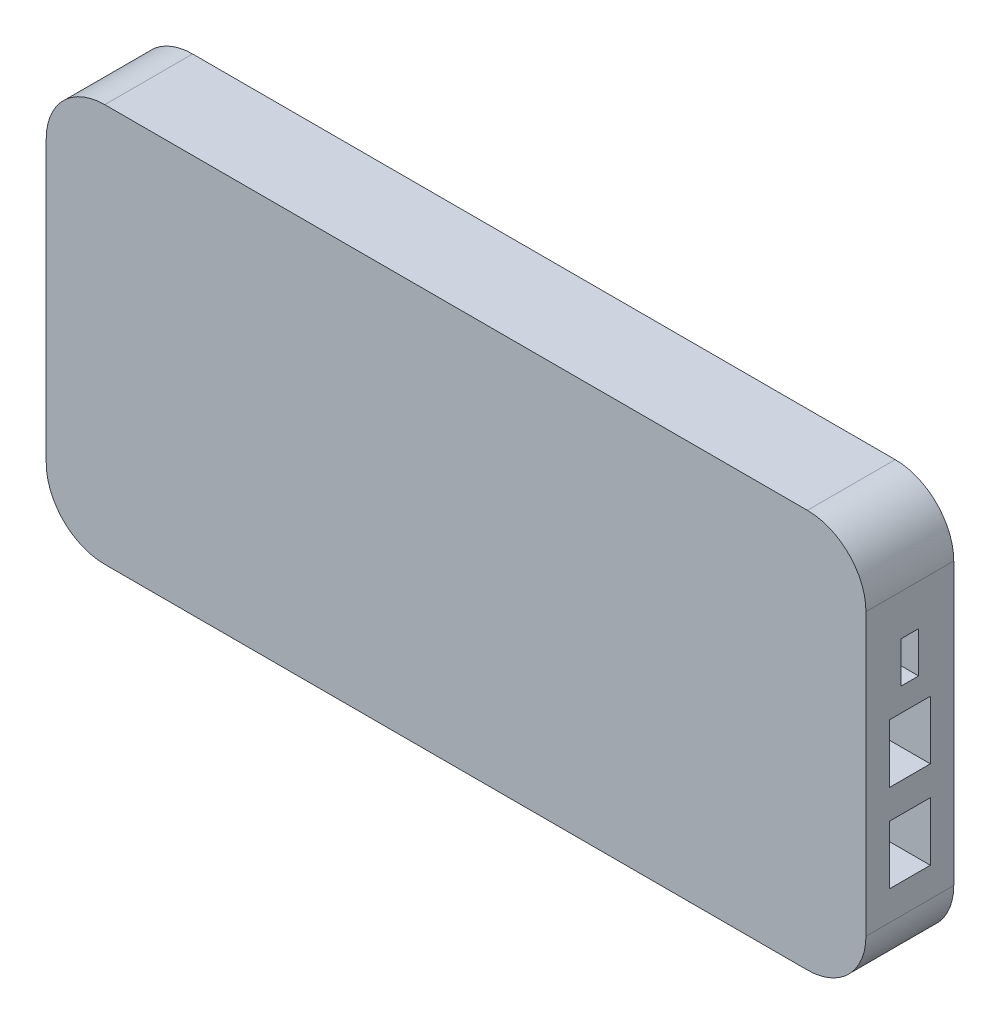
ISO-10303-21;
HEADER;
FILE_DESCRIPTION(('STEP AP214'),'2;1');
FILE_NAME('part.step','',(''),(''),'','','');
FILE_SCHEMA(('AUTOMOTIVE_DESIGN { 1 0 10303 214 1 1 1 1 }'));
ENDSEC;
DATA;
#1=APPLICATION_CONTEXT('core data for automotive mechanical design processes');
#2=APPLICATION_PROTOCOL_DEFINITION('international standard','automotive_design',2000,#1);
#3=PRODUCT_CONTEXT('',#1,'mechanical');
#4=PRODUCT('Part','Part','',(#3));
#5=PRODUCT_RELATED_PRODUCT_CATEGORY('part','',(#4));
#6=PRODUCT_DEFINITION_FORMATION('','',#4);
#7=PRODUCT_DEFINITION_CONTEXT('part definition',#1,'design');
#8=PRODUCT_DEFINITION('design','',#6,#7);
#9=PRODUCT_DEFINITION_SHAPE('','',#8);
#10=(LENGTH_UNIT() NAMED_UNIT(*) SI_UNIT(.MILLI.,.METRE.));
#11=(NAMED_UNIT(*) PLANE_ANGLE_UNIT() SI_UNIT($,.RADIAN.));
#12=(NAMED_UNIT(*) SI_UNIT($,.STERADIAN.) SOLID_ANGLE_UNIT());
#13=UNCERTAINTY_MEASURE_WITH_UNIT(LENGTH_MEASURE(1.E-05),#10,'distance_accuracy_value','');
#14=(GEOMETRIC_REPRESENTATION_CONTEXT(3) GLOBAL_UNCERTAINTY_ASSIGNED_CONTEXT((#13)) GLOBAL_UNIT_ASSIGNED_CONTEXT((#10,
#11,#12)) REPRESENTATION_CONTEXT('',''));
#15=CARTESIAN_POINT('',(0.,0.,0.));
#16=DIRECTION('',(0.,0.,1.));
#17=DIRECTION('',(1.,0.,0.));
#18=AXIS2_PLACEMENT_3D('',#15,#16,#17);
#19=CARTESIAN_POINT('',(130.,10.,15.));
#20=DIRECTION('',(0.,0.,-1.));
#21=DIRECTION('',(-1.,0.,0.));
#22=AXIS2_PLACEMENT_3D('',#19,#20,#21);
#23=CYLINDRICAL_SURFACE('',#22,10.);
#24=CARTESIAN_POINT('',(130.,10.,0.));
#25=DIRECTION('',(0.,0.,1.));
#26=DIRECTION('',(1.,0.,0.));
#27=AXIS2_PLACEMENT_3D('',#24,#25,#26);
#28=CIRCLE('',#27,10.);
#29=CARTESIAN_POINT('',(130.,0.,0.));
#30=VERTEX_POINT('',#29);
#31=CARTESIAN_POINT('',(140.,10.0000000000001,0.));
#32=VERTEX_POINT('',#31);
#33=EDGE_CURVE('E222',#30,#32,#28,.T.);
#34=ORIENTED_EDGE('',*,*,#33,.T.);
#35=DIRECTION('',(0.,0.,-1.));
#36=VECTOR('',#35,1.);
#37=CARTESIAN_POINT('',(140.,10.0000000000001,15.));
#38=LINE('',#37,#36);
#39=CARTESIAN_POINT('',(140.,10.0000000000001,15.));
#40=VERTEX_POINT('',#39);
#41=EDGE_CURVE('E11',#40,#32,#38,.T.);
#42=ORIENTED_EDGE('',*,*,#41,.F.);
#43=CARTESIAN_POINT('',(130.,10.,15.));
#44=DIRECTION('',(0.,0.,1.));
#45=DIRECTION('',(1.,0.,0.));
#46=AXIS2_PLACEMENT_3D('',#43,#44,#45);
#47=CIRCLE('',#46,10.);
#48=CARTESIAN_POINT('',(130.,0.,15.));
#49=VERTEX_POINT('',#48);
#50=EDGE_CURVE('E313',#49,#40,#47,.T.);
#51=ORIENTED_EDGE('',*,*,#50,.F.);
#52=DIRECTION('',(0.,0.,-1.));
#53=VECTOR('',#52,1.);
#54=CARTESIAN_POINT('',(130.,0.,15.));
#55=LINE('',#54,#53);
#56=EDGE_CURVE('E339',#49,#30,#55,.T.);
#57=ORIENTED_EDGE('',*,*,#56,.T.);
#58=EDGE_LOOP('',(#34,#42,#51,#57));
#59=FACE_BOUND('',#58,.T.);
#60=ADVANCED_FACE('F39',(#59),#23,.T.);
#61=CARTESIAN_POINT('',(140.,10.0000000000001,15.));
#62=DIRECTION('',(-1.,0.,0.));
#63=DIRECTION('',(0.,0.,1.));
#64=AXIS2_PLACEMENT_3D('',#61,#62,#63);
#65=PLANE('',#64);
#66=DIRECTION('',(0.,0.,-1.));
#67=VECTOR('',#66,1.);
#68=CARTESIAN_POINT('',(140.,15.0000000000001,11.));
#69=LINE('',#68,#67);
#70=CARTESIAN_POINT('',(140.,15.0000000000001,11.));
#71=VERTEX_POINT('',#70);
#72=CARTESIAN_POINT('',(140.,15.0000000000001,4.));
#73=VERTEX_POINT('',#72);
#74=EDGE_CURVE('E212',#71,#73,#69,.T.);
#75=ORIENTED_EDGE('',*,*,#74,.F.);
#76=DIRECTION('',(0.,-1.,0.));
#77=VECTOR('',#76,1.);
#78=CARTESIAN_POINT('',(140.,25.0000000000001,11.));
#79=LINE('',#78,#77);
#80=CARTESIAN_POINT('',(140.,25.0000000000001,11.));
#81=VERTEX_POINT('',#80);
#82=EDGE_CURVE('E54',#81,#71,#79,.T.);
#83=ORIENTED_EDGE('',*,*,#82,.F.);
#84=DIRECTION('',(0.,0.,1.));
#85=VECTOR('',#84,1.);
#86=CARTESIAN_POINT('',(140.,25.0000000000001,11.));
#87=LINE('',#86,#85);
#88=CARTESIAN_POINT('',(140.,25.0000000000001,4.));
#89=VERTEX_POINT('',#88);
#90=EDGE_CURVE('E199',#89,#81,#87,.T.);
#91=ORIENTED_EDGE('',*,*,#90,.F.);
#92=DIRECTION('',(0.,1.,0.));
#93=VECTOR('',#92,1.);
#94=CARTESIAN_POINT('',(140.,25.0000000000001,4.));
#95=LINE('',#94,#93);
#96=EDGE_CURVE('E203',#73,#89,#95,.T.);
#97=ORIENTED_EDGE('',*,*,#96,.F.);
#98=EDGE_LOOP('',(#75,#83,#91,#97));
#99=FACE_BOUND('',#98,.T.);
#100=DIRECTION('',(0.,0.,-1.));
#101=VECTOR('',#100,1.);
#102=CARTESIAN_POINT('',(140.,30.0000000000001,11.));
#103=LINE('',#102,#101);
#104=CARTESIAN_POINT('',(140.,30.0000000000001,11.));
#105=VERTEX_POINT('',#104);
#106=CARTESIAN_POINT('',(140.,30.0000000000001,4.));
#107=VERTEX_POINT('',#106);
#108=EDGE_CURVE('E248',#105,#107,#103,.T.);
#109=ORIENTED_EDGE('',*,*,#108,.F.);
#110=DIRECTION('',(0.,-1.,0.));
#111=VECTOR('',#110,1.);
#112=CARTESIAN_POINT('',(140.,40.0000000000001,11.));
#113=LINE('',#112,#111);
#114=CARTESIAN_POINT('',(140.,40.0000000000001,11.));
#115=VERTEX_POINT('',#114);
#116=EDGE_CURVE('E62',#115,#105,#113,.T.);
#117=ORIENTED_EDGE('',*,*,#116,.F.);
#118=DIRECTION('',(0.,0.,1.));
#119=VECTOR('',#118,1.);
#120=CARTESIAN_POINT('',(140.,40.0000000000001,11.));
#121=LINE('',#120,#119);
#122=CARTESIAN_POINT('',(140.,40.0000000000001,4.));
#123=VERTEX_POINT('',#122);
#124=EDGE_CURVE('E233',#123,#115,#121,.T.);
#125=ORIENTED_EDGE('',*,*,#124,.F.);
#126=DIRECTION('',(0.,1.,0.));
#127=VECTOR('',#126,1.);
#128=CARTESIAN_POINT('',(140.,40.0000000000001,4.));
#129=LINE('',#128,#127);
#130=EDGE_CURVE('E253',#107,#123,#129,.T.);
#131=ORIENTED_EDGE('',*,*,#130,.F.);
#132=EDGE_LOOP('',(#109,#117,#125,#131));
#133=FACE_BOUND('',#132,.T.);
#134=DIRECTION('',(0.,0.,-1.));
#135=VECTOR('',#134,1.);
#136=CARTESIAN_POINT('',(140.,44.0000000000001,9.));
#137=LINE('',#136,#135);
#138=CARTESIAN_POINT('',(140.,44.0000000000001,9.));
#139=VERTEX_POINT('',#138);
#140=CARTESIAN_POINT('',(140.,44.0000000000001,6.));
#141=VERTEX_POINT('',#140);
#142=EDGE_CURVE('E291',#139,#141,#137,.T.);
#143=ORIENTED_EDGE('',*,*,#142,.F.);
#144=DIRECTION('',(0.,-1.,0.));
#145=VECTOR('',#144,1.);
#146=CARTESIAN_POINT('',(140.,51.0000000000001,9.));
#147=LINE('',#146,#145);
#148=CARTESIAN_POINT('',(140.,51.0000000000001,9.));
#149=VERTEX_POINT('',#148);
#150=EDGE_CURVE('E288',#149,#139,#147,.T.);
#151=ORIENTED_EDGE('',*,*,#150,.F.);
#152=DIRECTION('',(0.,0.,1.));
#153=VECTOR('',#152,1.);
#154=CARTESIAN_POINT('',(140.,51.0000000000001,9.));
#155=LINE('',#154,#153);
#156=CARTESIAN_POINT('',(140.,51.0000000000001,6.));
#157=VERTEX_POINT('',#156);
#158=EDGE_CURVE('E275',#157,#149,#155,.T.);
#159=ORIENTED_EDGE('',*,*,#158,.F.);
#160=DIRECTION('',(0.,1.,0.));
#161=VECTOR('',#160,1.);
#162=CARTESIAN_POINT('',(140.,51.0000000000001,6.));
#163=LINE('',#162,#161);
#164=EDGE_CURVE('E295',#141,#157,#163,.T.);
#165=ORIENTED_EDGE('',*,*,#164,.F.);
#166=EDGE_LOOP('',(#143,#151,#159,#165));
#167=FACE_BOUND('',#166,.T.);
#168=DIRECTION('',(0.,1.,0.));
#169=VECTOR('',#168,1.);
#170=CARTESIAN_POINT('',(140.,10.0000000000001,0.));
#171=LINE('',#170,#169);
#172=CARTESIAN_POINT('',(140.,57.9999999999999,0.));
#173=VERTEX_POINT('',#172);
#174=EDGE_CURVE('E343',#32,#173,#171,.T.);
#175=ORIENTED_EDGE('',*,*,#174,.T.);
#176=DIRECTION('',(0.,0.,-1.));
#177=VECTOR('',#176,1.);
#178=CARTESIAN_POINT('',(140.,57.9999999999999,15.));
#179=LINE('',#178,#177);
#180=CARTESIAN_POINT('',(140.,57.9999999999999,15.));
#181=VERTEX_POINT('',#180);
#182=EDGE_CURVE('E47',#181,#173,#179,.T.);
#183=ORIENTED_EDGE('',*,*,#182,.F.);
#184=DIRECTION('',(0.,1.,0.));
#185=VECTOR('',#184,1.);
#186=CARTESIAN_POINT('',(140.,10.0000000000001,15.));
#187=LINE('',#186,#185);
#188=EDGE_CURVE('E317',#40,#181,#187,.T.);
#189=ORIENTED_EDGE('',*,*,#188,.F.);
#190=ORIENTED_EDGE('',*,*,#41,.T.);
#191=EDGE_LOOP('',(#175,#183,#189,#190));
#192=FACE_BOUND('',#191,.T.);
#193=ADVANCED_FACE('F414',(#99,#133,#167,#192),#65,.F.);
#194=CARTESIAN_POINT('',(130.,58.,15.));
#195=DIRECTION('',(0.,0.,-1.));
#196=DIRECTION('',(-1.,0.,0.));
#197=AXIS2_PLACEMENT_3D('',#194,#195,#196);
#198=CYLINDRICAL_SURFACE('',#197,10.);
#199=CARTESIAN_POINT('',(130.,58.,0.));
#200=DIRECTION('',(0.,0.,1.));
#201=DIRECTION('',(-1.,0.,0.));
#202=AXIS2_PLACEMENT_3D('',#199,#200,#201);
#203=CIRCLE('',#202,10.);
#204=CARTESIAN_POINT('',(130.,68.,0.));
#205=VERTEX_POINT('',#204);
#206=EDGE_CURVE('E346',#173,#205,#203,.T.);
#207=ORIENTED_EDGE('',*,*,#206,.T.);
#208=DIRECTION('',(0.,0.,-1.));
#209=VECTOR('',#208,1.);
#210=CARTESIAN_POINT('',(130.,68.,15.));
#211=LINE('',#210,#209);
#212=CARTESIAN_POINT('',(130.,68.,15.));
#213=VERTEX_POINT('',#212);
#214=EDGE_CURVE('E382',#213,#205,#211,.T.);
#215=ORIENTED_EDGE('',*,*,#214,.F.);
#216=CARTESIAN_POINT('',(130.,58.,15.));
#217=DIRECTION('',(0.,0.,1.));
#218=DIRECTION('',(-1.,0.,0.));
#219=AXIS2_PLACEMENT_3D('',#216,#217,#218);
#220=CIRCLE('',#219,10.);
#221=EDGE_CURVE('E321',#181,#213,#220,.T.);
#222=ORIENTED_EDGE('',*,*,#221,.F.);
#223=ORIENTED_EDGE('',*,*,#182,.T.);
#224=EDGE_LOOP('',(#207,#215,#222,#223));
#225=FACE_BOUND('',#224,.T.);
#226=ADVANCED_FACE('F391',(#225),#198,.T.);
#227=CARTESIAN_POINT('',(10.0000000000001,68.,15.));
#228=DIRECTION('',(0.,-1.,0.));
#229=DIRECTION('',(0.,0.,-1.));
#230=AXIS2_PLACEMENT_3D('',#227,#228,#229);
#231=PLANE('',#230);
#232=DIRECTION('',(-1.,0.,0.));
#233=VECTOR('',#232,1.);
#234=CARTESIAN_POINT('',(10.0000000000001,68.,0.));
#235=LINE('',#234,#233);
#236=CARTESIAN_POINT('',(10.0000000000001,68.,0.));
#237=VERTEX_POINT('',#236);
#238=EDGE_CURVE('E349',#205,#237,#235,.T.);
#239=ORIENTED_EDGE('',*,*,#238,.T.);
#240=DIRECTION('',(0.,0.,-1.));
#241=VECTOR('',#240,1.);
#242=CARTESIAN_POINT('',(10.0000000000001,68.,15.));
#243=LINE('',#242,#241);
#244=CARTESIAN_POINT('',(10.0000000000001,68.,15.));
#245=VERTEX_POINT('',#244);
#246=EDGE_CURVE('E378',#245,#237,#243,.T.);
#247=ORIENTED_EDGE('',*,*,#246,.F.);
#248=DIRECTION('',(-1.,0.,0.));
#249=VECTOR('',#248,1.);
#250=CARTESIAN_POINT('',(10.0000000000001,68.,15.));
#251=LINE('',#250,#249);
#252=EDGE_CURVE('E324',#213,#245,#251,.T.);
#253=ORIENTED_EDGE('',*,*,#252,.F.);
#254=ORIENTED_EDGE('',*,*,#214,.T.);
#255=EDGE_LOOP('',(#239,#247,#253,#254));
#256=FACE_BOUND('',#255,.T.);
#257=ADVANCED_FACE('F402',(#256),#231,.F.);
#258=CARTESIAN_POINT('',(10.,58.,15.));
#259=DIRECTION('',(0.,0.,-1.));
#260=DIRECTION('',(-1.,0.,0.));
#261=AXIS2_PLACEMENT_3D('',#258,#259,#260);
#262=CYLINDRICAL_SURFACE('',#261,10.);
#263=CARTESIAN_POINT('',(10.,58.,0.));
#264=DIRECTION('',(0.,0.,1.));
#265=DIRECTION('',(1.,0.,0.));
#266=AXIS2_PLACEMENT_3D('',#263,#264,#265);
#267=CIRCLE('',#266,10.);
#268=CARTESIAN_POINT('',(0.,57.9999999999999,0.));
#269=VERTEX_POINT('',#268);
#270=EDGE_CURVE('E352',#237,#269,#267,.T.);
#271=ORIENTED_EDGE('',*,*,#270,.T.);
#272=DIRECTION('',(0.,0.,-1.));
#273=VECTOR('',#272,1.);
#274=CARTESIAN_POINT('',(0.,57.9999999999999,15.));
#275=LINE('',#274,#273);
#276=CARTESIAN_POINT('',(0.,57.9999999999999,15.));
#277=VERTEX_POINT('',#276);
#278=EDGE_CURVE('E374',#277,#269,#275,.T.);
#279=ORIENTED_EDGE('',*,*,#278,.F.);
#280=CARTESIAN_POINT('',(10.,58.,15.));
#281=DIRECTION('',(0.,0.,1.));
#282=DIRECTION('',(1.,0.,0.));
#283=AXIS2_PLACEMENT_3D('',#280,#281,#282);
#284=CIRCLE('',#283,10.);
#285=EDGE_CURVE('E327',#245,#277,#284,.T.);
#286=ORIENTED_EDGE('',*,*,#285,.F.);
#287=ORIENTED_EDGE('',*,*,#246,.T.);
#288=EDGE_LOOP('',(#271,#279,#286,#287));
#289=FACE_BOUND('',#288,.T.);
#290=ADVANCED_FACE('F406',(#289),#262,.T.);
#291=CARTESIAN_POINT('',(0.,10.0000000000001,15.));
#292=DIRECTION('',(1.,0.,0.));
#293=DIRECTION('',(0.,0.,-1.));
#294=AXIS2_PLACEMENT_3D('',#291,#292,#293);
#295=PLANE('',#294);
#296=DIRECTION('',(0.,-1.,0.));
#297=VECTOR('',#296,1.);
#298=CARTESIAN_POINT('',(0.,10.0000000000001,0.));
#299=LINE('',#298,#297);
#300=CARTESIAN_POINT('',(0.,10.,0.));
#301=VERTEX_POINT('',#300);
#302=EDGE_CURVE('E355',#269,#301,#299,.T.);
#303=ORIENTED_EDGE('',*,*,#302,.T.);
#304=DIRECTION('',(0.,0.,-1.));
#305=VECTOR('',#304,1.);
#306=CARTESIAN_POINT('',(0.,10.,15.));
#307=LINE('',#306,#305);
#308=CARTESIAN_POINT('',(0.,10.,15.));
#309=VERTEX_POINT('',#308);
#310=EDGE_CURVE('E370',#309,#301,#307,.T.);
#311=ORIENTED_EDGE('',*,*,#310,.F.);
#312=DIRECTION('',(0.,-1.,0.));
#313=VECTOR('',#312,1.);
#314=CARTESIAN_POINT('',(0.,10.0000000000001,15.));
#315=LINE('',#314,#313);
#316=EDGE_CURVE('E330',#277,#309,#315,.T.);
#317=ORIENTED_EDGE('',*,*,#316,.F.);
#318=ORIENTED_EDGE('',*,*,#278,.T.);
#319=EDGE_LOOP('',(#303,#311,#317,#318));
#320=FACE_BOUND('',#319,.T.);
#321=ADVANCED_FACE('F427',(#320),#295,.F.);
#322=CARTESIAN_POINT('',(10.,10.,15.));
#323=DIRECTION('',(0.,0.,-1.));
#324=DIRECTION('',(-1.,0.,0.));
#325=AXIS2_PLACEMENT_3D('',#322,#323,#324);
#326=CYLINDRICAL_SURFACE('',#325,10.);
#327=CARTESIAN_POINT('',(10.,10.,0.));
#328=DIRECTION('',(0.,0.,1.));
#329=DIRECTION('',(-1.,0.,0.));
#330=AXIS2_PLACEMENT_3D('',#327,#328,#329);
#331=CIRCLE('',#330,10.);
#332=CARTESIAN_POINT('',(10.0000000000001,0.,0.));
#333=VERTEX_POINT('',#332);
#334=EDGE_CURVE('E358',#301,#333,#331,.T.);
#335=ORIENTED_EDGE('',*,*,#334,.T.);
#336=DIRECTION('',(0.,0.,-1.));
#337=VECTOR('',#336,1.);
#338=CARTESIAN_POINT('',(10.0000000000001,0.,15.));
#339=LINE('',#338,#337);
#340=CARTESIAN_POINT('',(10.0000000000001,0.,15.));
#341=VERTEX_POINT('',#340);
#342=EDGE_CURVE('E366',#341,#333,#339,.T.);
#343=ORIENTED_EDGE('',*,*,#342,.F.);
#344=CARTESIAN_POINT('',(10.,10.,15.));
#345=DIRECTION('',(0.,0.,1.));
#346=DIRECTION('',(-1.,0.,0.));
#347=AXIS2_PLACEMENT_3D('',#344,#345,#346);
#348=CIRCLE('',#347,10.);
#349=EDGE_CURVE('E333',#309,#341,#348,.T.);
#350=ORIENTED_EDGE('',*,*,#349,.F.);
#351=ORIENTED_EDGE('',*,*,#310,.T.);
#352=EDGE_LOOP('',(#335,#343,#350,#351));
#353=FACE_BOUND('',#352,.T.);
#354=ADVANCED_FACE('F425',(#353),#326,.T.);
#355=CARTESIAN_POINT('',(10.0000000000001,0.,15.));
#356=DIRECTION('',(0.,1.,0.));
#357=DIRECTION('',(0.,0.,1.));
#358=AXIS2_PLACEMENT_3D('',#355,#356,#357);
#359=PLANE('',#358);
#360=DIRECTION('',(1.,0.,0.));
#361=VECTOR('',#360,1.);
#362=CARTESIAN_POINT('',(10.0000000000001,0.,0.));
#363=LINE('',#362,#361);
#364=EDGE_CURVE('E318',#333,#30,#363,.T.);
#365=ORIENTED_EDGE('',*,*,#364,.T.);
#366=ORIENTED_EDGE('',*,*,#56,.F.);
#367=DIRECTION('',(1.,0.,0.));
#368=VECTOR('',#367,1.);
#369=CARTESIAN_POINT('',(10.0000000000001,0.,15.));
#370=LINE('',#369,#368);
#371=EDGE_CURVE('E336',#341,#49,#370,.T.);
#372=ORIENTED_EDGE('',*,*,#371,.F.);
#373=ORIENTED_EDGE('',*,*,#342,.T.);
#374=EDGE_LOOP('',(#365,#366,#372,#373));
#375=FACE_BOUND('',#374,.T.);
#376=ADVANCED_FACE('F420',(#375),#359,.F.);
#377=CARTESIAN_POINT('',(130.,10.,15.));
#378=DIRECTION('',(0.,0.,1.));
#379=DIRECTION('',(1.,0.,0.));
#380=AXIS2_PLACEMENT_3D('',#377,#378,#379);
#381=PLANE('',#380);
#382=ORIENTED_EDGE('',*,*,#50,.T.);
#383=ORIENTED_EDGE('',*,*,#188,.T.);
#384=ORIENTED_EDGE('',*,*,#221,.T.);
#385=ORIENTED_EDGE('',*,*,#252,.T.);
#386=ORIENTED_EDGE('',*,*,#285,.T.);
#387=ORIENTED_EDGE('',*,*,#316,.T.);
#388=ORIENTED_EDGE('',*,*,#349,.T.);
#389=ORIENTED_EDGE('',*,*,#371,.T.);
#390=EDGE_LOOP('',(#382,#383,#384,#385,#386,#387,#388,#389));
#391=FACE_BOUND('',#390,.T.);
#392=ADVANCED_FACE('F410',(#391),#381,.T.);
#393=CARTESIAN_POINT('',(130.,10.,0.));
#394=DIRECTION('',(0.,0.,1.));
#395=DIRECTION('',(1.,0.,0.));
#396=AXIS2_PLACEMENT_3D('',#393,#394,#395);
#397=PLANE('',#396);
#398=ORIENTED_EDGE('',*,*,#33,.F.);
#399=ORIENTED_EDGE('',*,*,#364,.F.);
#400=ORIENTED_EDGE('',*,*,#334,.F.);
#401=ORIENTED_EDGE('',*,*,#302,.F.);
#402=ORIENTED_EDGE('',*,*,#270,.F.);
#403=ORIENTED_EDGE('',*,*,#238,.F.);
#404=ORIENTED_EDGE('',*,*,#206,.F.);
#405=ORIENTED_EDGE('',*,*,#174,.F.);
#406=EDGE_LOOP('',(#398,#399,#400,#401,#402,#403,#404,#405));
#407=FACE_BOUND('',#406,.T.);
#408=ADVANCED_FACE('F397',(#407),#397,.F.);
#409=CARTESIAN_POINT('',(130.,51.0000000000001,9.));
#410=DIRECTION('',(0.,0.,1.));
#411=DIRECTION('',(0.,-1.,0.));
#412=AXIS2_PLACEMENT_3D('',#409,#410,#411);
#413=PLANE('',#412);
#414=ORIENTED_EDGE('',*,*,#150,.T.);
#415=DIRECTION('',(1.,0.,0.));
#416=VECTOR('',#415,1.);
#417=CARTESIAN_POINT('',(130.,44.0000000000001,9.));
#418=LINE('',#417,#416);
#419=CARTESIAN_POINT('',(130.,44.0000000000001,9.));
#420=VERTEX_POINT('',#419);
#421=EDGE_CURVE('E287',#420,#139,#418,.T.);
#422=ORIENTED_EDGE('',*,*,#421,.F.);
#423=DIRECTION('',(0.,-1.,0.));
#424=VECTOR('',#423,1.);
#425=CARTESIAN_POINT('',(130.,51.0000000000001,9.));
#426=LINE('',#425,#424);
#427=CARTESIAN_POINT('',(130.,51.0000000000001,9.));
#428=VERTEX_POINT('',#427);
#429=EDGE_CURVE('E270',#428,#420,#426,.T.);
#430=ORIENTED_EDGE('',*,*,#429,.F.);
#431=DIRECTION('',(1.,0.,0.));
#432=VECTOR('',#431,1.);
#433=CARTESIAN_POINT('',(130.,51.0000000000001,9.));
#434=LINE('',#433,#432);
#435=EDGE_CURVE('E249',#428,#149,#434,.T.);
#436=ORIENTED_EDGE('',*,*,#435,.T.);
#437=EDGE_LOOP('',(#414,#422,#430,#436));
#438=FACE_BOUND('',#437,.T.);
#439=ADVANCED_FACE('F490',(#438),#413,.F.);
#440=CARTESIAN_POINT('',(130.,51.0000000000001,9.));
#441=DIRECTION('',(0.,1.,0.));
#442=DIRECTION('',(0.,0.,1.));
#443=AXIS2_PLACEMENT_3D('',#440,#441,#442);
#444=PLANE('',#443);
#445=ORIENTED_EDGE('',*,*,#158,.T.);
#446=ORIENTED_EDGE('',*,*,#435,.F.);
#447=DIRECTION('',(0.,0.,1.));
#448=VECTOR('',#447,1.);
#449=CARTESIAN_POINT('',(130.,51.0000000000001,9.));
#450=LINE('',#449,#448);
#451=CARTESIAN_POINT('',(130.,51.0000000000001,6.));
#452=VERTEX_POINT('',#451);
#453=EDGE_CURVE('E283',#452,#428,#450,.T.);
#454=ORIENTED_EDGE('',*,*,#453,.F.);
#455=DIRECTION('',(1.,0.,0.));
#456=VECTOR('',#455,1.);
#457=CARTESIAN_POINT('',(130.,51.0000000000001,6.));
#458=LINE('',#457,#456);
#459=EDGE_CURVE('E304',#452,#157,#458,.T.);
#460=ORIENTED_EDGE('',*,*,#459,.T.);
#461=EDGE_LOOP('',(#445,#446,#454,#460));
#462=FACE_BOUND('',#461,.T.);
#463=ADVANCED_FACE('F506',(#462),#444,.F.);
#464=CARTESIAN_POINT('',(130.,51.0000000000001,6.));
#465=DIRECTION('',(0.,0.,-1.));
#466=DIRECTION('',(0.,1.,0.));
#467=AXIS2_PLACEMENT_3D('',#464,#465,#466);
#468=PLANE('',#467);
#469=ORIENTED_EDGE('',*,*,#164,.T.);
#470=ORIENTED_EDGE('',*,*,#459,.F.);
#471=DIRECTION('',(0.,1.,0.));
#472=VECTOR('',#471,1.);
#473=CARTESIAN_POINT('',(130.,51.0000000000001,6.));
#474=LINE('',#473,#472);
#475=CARTESIAN_POINT('',(130.,44.0000000000001,6.));
#476=VERTEX_POINT('',#475);
#477=EDGE_CURVE('E279',#476,#452,#474,.T.);
#478=ORIENTED_EDGE('',*,*,#477,.F.);
#479=DIRECTION('',(1.,0.,0.));
#480=VECTOR('',#479,1.);
#481=CARTESIAN_POINT('',(130.,44.0000000000001,6.));
#482=LINE('',#481,#480);
#483=EDGE_CURVE('E307',#476,#141,#482,.T.);
#484=ORIENTED_EDGE('',*,*,#483,.T.);
#485=EDGE_LOOP('',(#469,#470,#478,#484));
#486=FACE_BOUND('',#485,.T.);
#487=ADVANCED_FACE('F516',(#486),#468,.F.);
#488=CARTESIAN_POINT('',(130.,44.0000000000001,9.));
#489=DIRECTION('',(0.,-1.,0.));
#490=DIRECTION('',(0.,0.,-1.));
#491=AXIS2_PLACEMENT_3D('',#488,#489,#490);
#492=PLANE('',#491);
#493=ORIENTED_EDGE('',*,*,#142,.T.);
#494=ORIENTED_EDGE('',*,*,#483,.F.);
#495=DIRECTION('',(0.,0.,-1.));
#496=VECTOR('',#495,1.);
#497=CARTESIAN_POINT('',(130.,44.0000000000001,9.));
#498=LINE('',#497,#496);
#499=EDGE_CURVE('E274',#420,#476,#498,.T.);
#500=ORIENTED_EDGE('',*,*,#499,.F.);
#501=ORIENTED_EDGE('',*,*,#421,.T.);
#502=EDGE_LOOP('',(#493,#494,#500,#501));
#503=FACE_BOUND('',#502,.T.);
#504=ADVANCED_FACE('F526',(#503),#492,.F.);
#505=CARTESIAN_POINT('',(130.,0.,0.));
#506=DIRECTION('',(1.,0.,0.));
#507=DIRECTION('',(0.,0.,-1.));
#508=AXIS2_PLACEMENT_3D('',#505,#506,#507);
#509=PLANE('',#508);
#510=ORIENTED_EDGE('',*,*,#429,.T.);
#511=ORIENTED_EDGE('',*,*,#499,.T.);
#512=ORIENTED_EDGE('',*,*,#477,.T.);
#513=ORIENTED_EDGE('',*,*,#453,.T.);
#514=EDGE_LOOP('',(#510,#511,#512,#513));
#515=FACE_BOUND('',#514,.T.);
#516=ADVANCED_FACE('F536',(#515),#509,.T.);
#517=CARTESIAN_POINT('',(130.,40.0000000000001,11.));
#518=DIRECTION('',(0.,0.,1.));
#519=DIRECTION('',(0.,-1.,0.));
#520=AXIS2_PLACEMENT_3D('',#517,#518,#519);
#521=PLANE('',#520);
#522=ORIENTED_EDGE('',*,*,#116,.T.);
#523=DIRECTION('',(1.,0.,0.));
#524=VECTOR('',#523,1.);
#525=CARTESIAN_POINT('',(130.,30.0000000000001,11.));
#526=LINE('',#525,#524);
#527=CARTESIAN_POINT('',(130.,30.0000000000001,11.));
#528=VERTEX_POINT('',#527);
#529=EDGE_CURVE('E245',#528,#105,#526,.T.);
#530=ORIENTED_EDGE('',*,*,#529,.F.);
#531=DIRECTION('',(0.,-1.,0.));
#532=VECTOR('',#531,1.);
#533=CARTESIAN_POINT('',(130.,40.0000000000001,11.));
#534=LINE('',#533,#532);
#535=CARTESIAN_POINT('',(130.,40.0000000000001,11.));
#536=VERTEX_POINT('',#535);
#537=EDGE_CURVE('E228',#536,#528,#534,.T.);
#538=ORIENTED_EDGE('',*,*,#537,.F.);
#539=DIRECTION('',(1.,0.,0.));
#540=VECTOR('',#539,1.);
#541=CARTESIAN_POINT('',(130.,40.0000000000001,11.));
#542=LINE('',#541,#540);
#543=EDGE_CURVE('E213',#536,#115,#542,.T.);
#544=ORIENTED_EDGE('',*,*,#543,.T.);
#545=EDGE_LOOP('',(#522,#530,#538,#544));
#546=FACE_BOUND('',#545,.T.);
#547=ADVANCED_FACE('F546',(#546),#521,.F.);
#548=CARTESIAN_POINT('',(130.,40.0000000000001,11.));
#549=DIRECTION('',(0.,1.,0.));
#550=DIRECTION('',(0.,0.,1.));
#551=AXIS2_PLACEMENT_3D('',#548,#549,#550);
#552=PLANE('',#551);
#553=ORIENTED_EDGE('',*,*,#124,.T.);
#554=ORIENTED_EDGE('',*,*,#543,.F.);
#555=DIRECTION('',(0.,0.,1.));
#556=VECTOR('',#555,1.);
#557=CARTESIAN_POINT('',(130.,40.0000000000001,11.));
#558=LINE('',#557,#556);
#559=CARTESIAN_POINT('',(130.,40.0000000000001,4.));
#560=VERTEX_POINT('',#559);
#561=EDGE_CURVE('E241',#560,#536,#558,.T.);
#562=ORIENTED_EDGE('',*,*,#561,.F.);
#563=DIRECTION('',(1.,0.,0.));
#564=VECTOR('',#563,1.);
#565=CARTESIAN_POINT('',(130.,40.0000000000001,4.));
#566=LINE('',#565,#564);
#567=EDGE_CURVE('E262',#560,#123,#566,.T.);
#568=ORIENTED_EDGE('',*,*,#567,.T.);
#569=EDGE_LOOP('',(#553,#554,#562,#568));
#570=FACE_BOUND('',#569,.T.);
#571=ADVANCED_FACE('F556',(#570),#552,.F.);
#572=CARTESIAN_POINT('',(130.,40.0000000000001,4.));
#573=DIRECTION('',(0.,0.,-1.));
#574=DIRECTION('',(0.,1.,0.));
#575=AXIS2_PLACEMENT_3D('',#572,#573,#574);
#576=PLANE('',#575);
#577=ORIENTED_EDGE('',*,*,#130,.T.);
#578=ORIENTED_EDGE('',*,*,#567,.F.);
#579=DIRECTION('',(0.,1.,0.));
#580=VECTOR('',#579,1.);
#581=CARTESIAN_POINT('',(130.,40.0000000000001,4.));
#582=LINE('',#581,#580);
#583=CARTESIAN_POINT('',(130.,30.0000000000001,4.));
#584=VERTEX_POINT('',#583);
#585=EDGE_CURVE('E237',#584,#560,#582,.T.);
#586=ORIENTED_EDGE('',*,*,#585,.F.);
#587=DIRECTION('',(1.,0.,0.));
#588=VECTOR('',#587,1.);
#589=CARTESIAN_POINT('',(130.,30.0000000000001,4.));
#590=LINE('',#589,#588);
#591=EDGE_CURVE('E265',#584,#107,#590,.T.);
#592=ORIENTED_EDGE('',*,*,#591,.T.);
#593=EDGE_LOOP('',(#577,#578,#586,#592));
#594=FACE_BOUND('',#593,.T.);
#595=ADVANCED_FACE('F565',(#594),#576,.F.);
#596=CARTESIAN_POINT('',(130.,30.0000000000001,11.));
#597=DIRECTION('',(0.,-1.,0.));
#598=DIRECTION('',(0.,0.,-1.));
#599=AXIS2_PLACEMENT_3D('',#596,#597,#598);
#600=PLANE('',#599);
#601=ORIENTED_EDGE('',*,*,#108,.T.);
#602=ORIENTED_EDGE('',*,*,#591,.F.);
#603=DIRECTION('',(0.,0.,-1.));
#604=VECTOR('',#603,1.);
#605=CARTESIAN_POINT('',(130.,30.0000000000001,11.));
#606=LINE('',#605,#604);
#607=EDGE_CURVE('E232',#528,#584,#606,.T.);
#608=ORIENTED_EDGE('',*,*,#607,.F.);
#609=ORIENTED_EDGE('',*,*,#529,.T.);
#610=EDGE_LOOP('',(#601,#602,#608,#609));
#611=FACE_BOUND('',#610,.T.);
#612=ADVANCED_FACE('F575',(#611),#600,.F.);
#613=CARTESIAN_POINT('',(130.,0.,0.));
#614=DIRECTION('',(1.,0.,0.));
#615=DIRECTION('',(0.,0.,-1.));
#616=AXIS2_PLACEMENT_3D('',#613,#614,#615);
#617=PLANE('',#616);
#618=ORIENTED_EDGE('',*,*,#537,.T.);
#619=ORIENTED_EDGE('',*,*,#607,.T.);
#620=ORIENTED_EDGE('',*,*,#585,.T.);
#621=ORIENTED_EDGE('',*,*,#561,.T.);
#622=EDGE_LOOP('',(#618,#619,#620,#621));
#623=FACE_BOUND('',#622,.T.);
#624=ADVANCED_FACE('F585',(#623),#617,.T.);
#625=CARTESIAN_POINT('',(130.,25.0000000000001,11.));
#626=DIRECTION('',(0.,0.,1.));
#627=DIRECTION('',(0.,-1.,0.));
#628=AXIS2_PLACEMENT_3D('',#625,#626,#627);
#629=PLANE('',#628);
#630=ORIENTED_EDGE('',*,*,#82,.T.);
#631=DIRECTION('',(1.,0.,0.));
#632=VECTOR('',#631,1.);
#633=CARTESIAN_POINT('',(130.,15.0000000000001,11.));
#634=LINE('',#633,#632);
#635=CARTESIAN_POINT('',(130.,15.0000000000001,11.));
#636=VERTEX_POINT('',#635);
#637=EDGE_CURVE('E174',#636,#71,#634,.T.);
#638=ORIENTED_EDGE('',*,*,#637,.F.);
#639=DIRECTION('',(0.,-1.,0.));
#640=VECTOR('',#639,1.);
#641=CARTESIAN_POINT('',(130.,25.0000000000001,11.));
#642=LINE('',#641,#640);
#643=CARTESIAN_POINT('',(130.,25.0000000000001,11.));
#644=VERTEX_POINT('',#643);
#645=EDGE_CURVE('E178',#644,#636,#642,.T.);
#646=ORIENTED_EDGE('',*,*,#645,.F.);
#647=DIRECTION('',(1.,0.,0.));
#648=VECTOR('',#647,1.);
#649=CARTESIAN_POINT('',(130.,25.0000000000001,11.));
#650=LINE('',#649,#648);
#651=EDGE_CURVE('E219',#644,#81,#650,.T.);
#652=ORIENTED_EDGE('',*,*,#651,.T.);
#653=EDGE_LOOP('',(#630,#638,#646,#652));
#654=FACE_BOUND('',#653,.T.);
#655=ADVANCED_FACE('F176',(#654),#629,.F.);
#656=CARTESIAN_POINT('',(130.,25.0000000000001,11.));
#657=DIRECTION('',(0.,1.,0.));
#658=DIRECTION('',(0.,0.,1.));
#659=AXIS2_PLACEMENT_3D('',#656,#657,#658);
#660=PLANE('',#659);
#661=ORIENTED_EDGE('',*,*,#90,.T.);
#662=ORIENTED_EDGE('',*,*,#651,.F.);
#663=DIRECTION('',(0.,0.,1.));
#664=VECTOR('',#663,1.);
#665=CARTESIAN_POINT('',(130.,25.0000000000001,11.));
#666=LINE('',#665,#664);
#667=CARTESIAN_POINT('',(130.,25.0000000000001,4.));
#668=VERTEX_POINT('',#667);
#669=EDGE_CURVE('E185',#668,#644,#666,.T.);
#670=ORIENTED_EDGE('',*,*,#669,.F.);
#671=DIRECTION('',(1.,0.,0.));
#672=VECTOR('',#671,1.);
#673=CARTESIAN_POINT('',(130.,25.0000000000001,4.));
#674=LINE('',#673,#672);
#675=EDGE_CURVE('E223',#668,#89,#674,.T.);
#676=ORIENTED_EDGE('',*,*,#675,.T.);
#677=EDGE_LOOP('',(#661,#662,#670,#676));
#678=FACE_BOUND('',#677,.T.);
#679=ADVANCED_FACE('F604',(#678),#660,.F.);
#680=CARTESIAN_POINT('',(130.,25.0000000000001,4.));
#681=DIRECTION('',(0.,0.,-1.));
#682=DIRECTION('',(0.,1.,0.));
#683=AXIS2_PLACEMENT_3D('',#680,#681,#682);
#684=PLANE('',#683);
#685=ORIENTED_EDGE('',*,*,#96,.T.);
#686=ORIENTED_EDGE('',*,*,#675,.F.);
#687=DIRECTION('',(0.,1.,0.));
#688=VECTOR('',#687,1.);
#689=CARTESIAN_POINT('',(130.,25.0000000000001,4.));
#690=LINE('',#689,#688);
#691=CARTESIAN_POINT('',(130.,15.0000000000001,4.));
#692=VERTEX_POINT('',#691);
#693=EDGE_CURVE('E194',#692,#668,#690,.T.);
#694=ORIENTED_EDGE('',*,*,#693,.F.);
#695=DIRECTION('',(1.,0.,0.));
#696=VECTOR('',#695,1.);
#697=CARTESIAN_POINT('',(130.,15.0000000000001,4.));
#698=LINE('',#697,#696);
#699=EDGE_CURVE('E184',#692,#73,#698,.T.);
#700=ORIENTED_EDGE('',*,*,#699,.T.);
#701=EDGE_LOOP('',(#685,#686,#694,#700));
#702=FACE_BOUND('',#701,.T.);
#703=ADVANCED_FACE('F613',(#702),#684,.F.);
#704=CARTESIAN_POINT('',(130.,15.0000000000001,11.));
#705=DIRECTION('',(0.,-1.,0.));
#706=DIRECTION('',(0.,0.,-1.));
#707=AXIS2_PLACEMENT_3D('',#704,#705,#706);
#708=PLANE('',#707);
#709=ORIENTED_EDGE('',*,*,#74,.T.);
#710=ORIENTED_EDGE('',*,*,#699,.F.);
#711=DIRECTION('',(0.,0.,-1.));
#712=VECTOR('',#711,1.);
#713=CARTESIAN_POINT('',(130.,15.0000000000001,11.));
#714=LINE('',#713,#712);
#715=EDGE_CURVE('E188',#636,#692,#714,.T.);
#716=ORIENTED_EDGE('',*,*,#715,.F.);
#717=ORIENTED_EDGE('',*,*,#637,.T.);
#718=EDGE_LOOP('',(#709,#710,#716,#717));
#719=FACE_BOUND('',#718,.T.);
#720=ADVANCED_FACE('F189',(#719),#708,.F.);
#721=CARTESIAN_POINT('',(130.,0.,0.));
#722=DIRECTION('',(1.,0.,0.));
#723=DIRECTION('',(0.,0.,-1.));
#724=AXIS2_PLACEMENT_3D('',#721,#722,#723);
#725=PLANE('',#724);
#726=ORIENTED_EDGE('',*,*,#645,.T.);
#727=ORIENTED_EDGE('',*,*,#715,.T.);
#728=ORIENTED_EDGE('',*,*,#693,.T.);
#729=ORIENTED_EDGE('',*,*,#669,.T.);
#730=EDGE_LOOP('',(#726,#727,#728,#729));
#731=FACE_BOUND('',#730,.T.);
#732=ADVANCED_FACE('F196',(#731),#725,.T.);
#733=CLOSED_SHELL('',(#60,#193,#226,#257,#290,#321,#354,#376,#392,#408,#439,#463,#487,#504,#516,
#547,#571,#595,#612,#624,#655,#679,#703,#720,#732));
#734=MANIFOLD_SOLID_BREP('B2',#733);
#735=ADVANCED_BREP_SHAPE_REPRESENTATION('',(#18,#734),#14);
#736=SHAPE_DEFINITION_REPRESENTATION(#9,#735);
ENDSEC;
END-ISO-10303-21;
